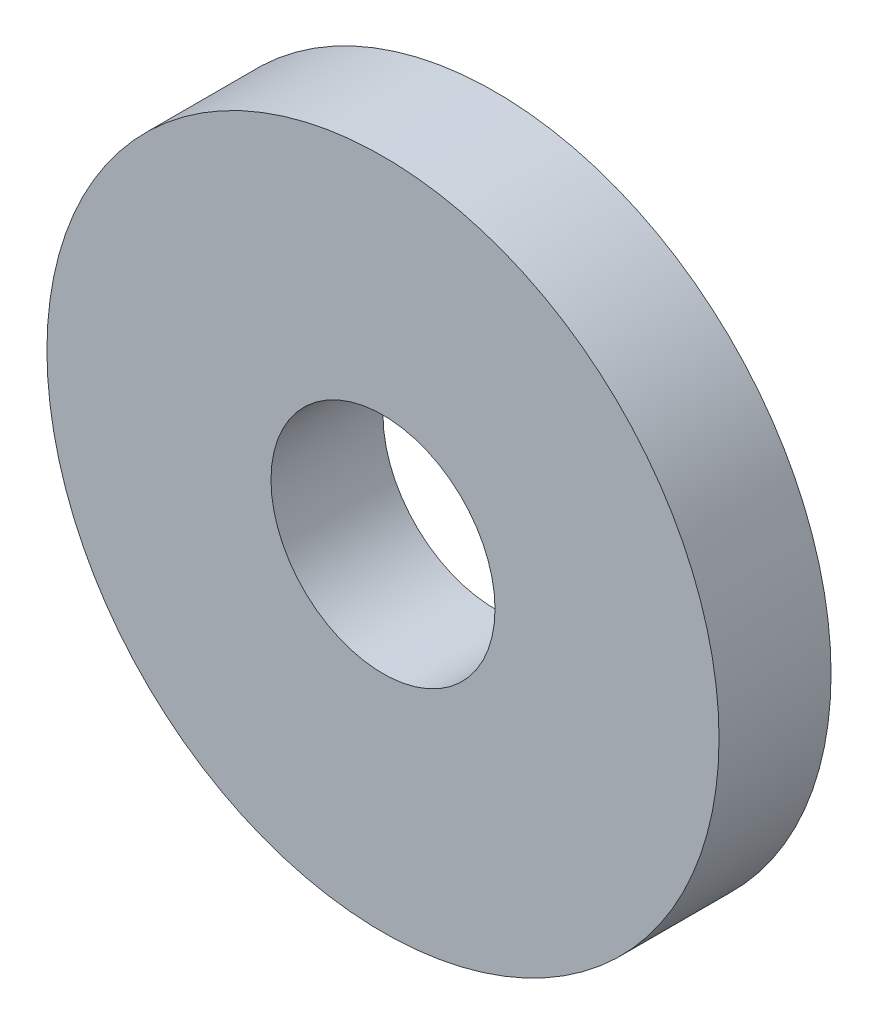
ISO-10303-21;
HEADER;
FILE_DESCRIPTION(('STEP AP214'),'2;1');
FILE_NAME('part.step','',(''),(''),'','','');
FILE_SCHEMA(('AUTOMOTIVE_DESIGN { 1 0 10303 214 1 1 1 1 }'));
ENDSEC;
DATA;
#1=APPLICATION_CONTEXT('core data for automotive mechanical design processes');
#2=APPLICATION_PROTOCOL_DEFINITION('international standard','automotive_design',2000,#1);
#3=PRODUCT_CONTEXT('',#1,'mechanical');
#4=PRODUCT('Part','Part','',(#3));
#5=PRODUCT_RELATED_PRODUCT_CATEGORY('part','',(#4));
#6=PRODUCT_DEFINITION_FORMATION('','',#4);
#7=PRODUCT_DEFINITION_CONTEXT('part definition',#1,'design');
#8=PRODUCT_DEFINITION('design','',#6,#7);
#9=PRODUCT_DEFINITION_SHAPE('','',#8);
#10=(LENGTH_UNIT() NAMED_UNIT(*) SI_UNIT(.MILLI.,.METRE.));
#11=(NAMED_UNIT(*) PLANE_ANGLE_UNIT() SI_UNIT($,.RADIAN.));
#12=(NAMED_UNIT(*) SI_UNIT($,.STERADIAN.) SOLID_ANGLE_UNIT());
#13=UNCERTAINTY_MEASURE_WITH_UNIT(LENGTH_MEASURE(1.E-05),#10,'distance_accuracy_value','');
#14=(GEOMETRIC_REPRESENTATION_CONTEXT(3) GLOBAL_UNCERTAINTY_ASSIGNED_CONTEXT((#13)) GLOBAL_UNIT_ASSIGNED_CONTEXT((#10,
#11,#12)) REPRESENTATION_CONTEXT('',''));
#15=CARTESIAN_POINT('',(0.,0.,0.));
#16=DIRECTION('',(0.,0.,1.));
#17=DIRECTION('',(1.,0.,0.));
#18=AXIS2_PLACEMENT_3D('',#15,#16,#17);
#19=CARTESIAN_POINT('',(0.,0.,10.));
#20=DIRECTION('',(0.,0.,-1.));
#21=DIRECTION('',(-1.,0.,0.));
#22=AXIS2_PLACEMENT_3D('',#19,#20,#21);
#23=CYLINDRICAL_SURFACE('',#22,30.);
#24=CARTESIAN_POINT('',(0.,0.,10.));
#25=DIRECTION('',(0.,0.,1.));
#26=DIRECTION('',(1.,0.,0.));
#27=AXIS2_PLACEMENT_3D('',#24,#25,#26);
#28=CIRCLE('',#27,30.);
#29=CARTESIAN_POINT('',(30.,0.,10.));
#30=VERTEX_POINT('',#29);
#31=EDGE_CURVE('E11',#30,#30,#28,.T.);
#32=ORIENTED_EDGE('',*,*,#31,.F.);
#33=EDGE_LOOP('',(#32));
#34=FACE_BOUND('',#33,.T.);
#35=CARTESIAN_POINT('',(0.,0.,0.));
#36=DIRECTION('',(0.,0.,1.));
#37=DIRECTION('',(1.,0.,0.));
#38=AXIS2_PLACEMENT_3D('',#35,#36,#37);
#39=CIRCLE('',#38,30.);
#40=CARTESIAN_POINT('',(30.,0.,0.));
#41=VERTEX_POINT('',#40);
#42=EDGE_CURVE('E46',#41,#41,#39,.T.);
#43=ORIENTED_EDGE('',*,*,#42,.T.);
#44=EDGE_LOOP('',(#43));
#45=FACE_BOUND('',#44,.T.);
#46=ADVANCED_FACE('F43',(#34,#45),#23,.T.);
#47=CARTESIAN_POINT('',(0.,0.,10.));
#48=DIRECTION('',(0.,0.,1.));
#49=DIRECTION('',(1.,0.,0.));
#50=AXIS2_PLACEMENT_3D('',#47,#48,#49);
#51=PLANE('',#50);
#52=CARTESIAN_POINT('',(0.,0.,10.));
#53=DIRECTION('',(0.,0.,-1.));
#54=DIRECTION('',(-1.,0.,0.));
#55=AXIS2_PLACEMENT_3D('',#52,#53,#54);
#56=CIRCLE('',#55,10.);
#57=CARTESIAN_POINT('',(-10.,0.,10.));
#58=VERTEX_POINT('',#57);
#59=EDGE_CURVE('E64',#58,#58,#56,.T.);
#60=ORIENTED_EDGE('',*,*,#59,.T.);
#61=EDGE_LOOP('',(#60));
#62=FACE_BOUND('',#61,.T.);
#63=ORIENTED_EDGE('',*,*,#31,.T.);
#64=EDGE_LOOP('',(#63));
#65=FACE_BOUND('',#64,.T.);
#66=ADVANCED_FACE('F73',(#62,#65),#51,.T.);
#67=CARTESIAN_POINT('',(0.,0.,0.));
#68=DIRECTION('',(0.,0.,1.));
#69=DIRECTION('',(1.,0.,0.));
#70=AXIS2_PLACEMENT_3D('',#67,#68,#69);
#71=PLANE('',#70);
#72=CARTESIAN_POINT('',(0.,0.,0.));
#73=DIRECTION('',(0.,0.,1.));
#74=DIRECTION('',(1.,0.,0.));
#75=AXIS2_PLACEMENT_3D('',#72,#73,#74);
#76=CIRCLE('',#75,20.);
#77=CARTESIAN_POINT('',(20.,0.,0.));
#78=VERTEX_POINT('',#77);
#79=EDGE_CURVE('E55',#78,#78,#76,.T.);
#80=ORIENTED_EDGE('',*,*,#79,.T.);
#81=EDGE_LOOP('',(#80));
#82=FACE_BOUND('',#81,.T.);
#83=ORIENTED_EDGE('',*,*,#42,.F.);
#84=EDGE_LOOP('',(#83));
#85=FACE_BOUND('',#84,.T.);
#86=ADVANCED_FACE('F85',(#82,#85),#71,.F.);
#87=CARTESIAN_POINT('',(0.,0.,7.));
#88=DIRECTION('',(0.,0.,1.));
#89=DIRECTION('',(1.,0.,0.));
#90=AXIS2_PLACEMENT_3D('',#87,#88,#89);
#91=PLANE('',#90);
#92=CARTESIAN_POINT('',(0.,0.,7.));
#93=DIRECTION('',(0.,0.,1.));
#94=DIRECTION('',(1.,0.,0.));
#95=AXIS2_PLACEMENT_3D('',#92,#93,#94);
#96=CIRCLE('',#95,20.);
#97=CARTESIAN_POINT('',(20.,0.,7.));
#98=VERTEX_POINT('',#97);
#99=EDGE_CURVE('E53',#98,#98,#96,.T.);
#100=ORIENTED_EDGE('',*,*,#99,.F.);
#101=EDGE_LOOP('',(#100));
#102=FACE_BOUND('',#101,.T.);
#103=CARTESIAN_POINT('',(0.,0.,7.));
#104=DIRECTION('',(0.,0.,1.));
#105=DIRECTION('',(1.,0.,0.));
#106=AXIS2_PLACEMENT_3D('',#103,#104,#105);
#107=CIRCLE('',#106,15.);
#108=CARTESIAN_POINT('',(15.,0.,7.));
#109=VERTEX_POINT('',#108);
#110=EDGE_CURVE('E58',#109,#109,#107,.T.);
#111=ORIENTED_EDGE('',*,*,#110,.T.);
#112=EDGE_LOOP('',(#111));
#113=FACE_BOUND('',#112,.T.);
#114=ADVANCED_FACE('F96',(#102,#113),#91,.F.);
#115=CARTESIAN_POINT('',(0.,0.,7.));
#116=DIRECTION('',(0.,0.,-1.));
#117=DIRECTION('',(-1.,0.,0.));
#118=AXIS2_PLACEMENT_3D('',#115,#116,#117);
#119=CYLINDRICAL_SURFACE('',#118,20.);
#120=ORIENTED_EDGE('',*,*,#99,.T.);
#121=EDGE_LOOP('',(#120));
#122=FACE_BOUND('',#121,.T.);
#123=ORIENTED_EDGE('',*,*,#79,.F.);
#124=EDGE_LOOP('',(#123));
#125=FACE_BOUND('',#124,.T.);
#126=ADVANCED_FACE('F89',(#122,#125),#119,.F.);
#127=CARTESIAN_POINT('',(0.,0.,7.));
#128=DIRECTION('',(0.,0.,-1.));
#129=DIRECTION('',(-1.,0.,0.));
#130=AXIS2_PLACEMENT_3D('',#127,#128,#129);
#131=CYLINDRICAL_SURFACE('',#130,15.);
#132=ORIENTED_EDGE('',*,*,#110,.F.);
#133=EDGE_LOOP('',(#132));
#134=FACE_BOUND('',#133,.T.);
#135=CARTESIAN_POINT('',(0.,0.,0.));
#136=DIRECTION('',(0.,0.,1.));
#137=DIRECTION('',(1.,0.,0.));
#138=AXIS2_PLACEMENT_3D('',#135,#136,#137);
#139=CIRCLE('',#138,15.);
#140=CARTESIAN_POINT('',(15.,0.,0.));
#141=VERTEX_POINT('',#140);
#142=EDGE_CURVE('E61',#141,#141,#139,.T.);
#143=ORIENTED_EDGE('',*,*,#142,.T.);
#144=EDGE_LOOP('',(#143));
#145=FACE_BOUND('',#144,.T.);
#146=ADVANCED_FACE('F84',(#134,#145),#131,.T.);
#147=CARTESIAN_POINT('',(0.,0.,0.));
#148=DIRECTION('',(0.,0.,-1.));
#149=DIRECTION('',(-1.,0.,0.));
#150=AXIS2_PLACEMENT_3D('',#147,#148,#149);
#151=CIRCLE('',#150,10.);
#152=CARTESIAN_POINT('',(-10.,0.,0.));
#153=VERTEX_POINT('',#152);
#154=EDGE_CURVE('E67',#153,#153,#151,.T.);
#155=ORIENTED_EDGE('',*,*,#154,.F.);
#156=EDGE_LOOP('',(#155));
#157=FACE_BOUND('',#156,.T.);
#158=ORIENTED_EDGE('',*,*,#142,.F.);
#159=EDGE_LOOP('',(#158));
#160=FACE_BOUND('',#159,.T.);
#161=ADVANCED_FACE('F78',(#157,#160),#71,.F.);
#162=CARTESIAN_POINT('',(0.,0.,10.));
#163=DIRECTION('',(0.,0.,-1.));
#164=DIRECTION('',(-1.,0.,0.));
#165=AXIS2_PLACEMENT_3D('',#162,#163,#164);
#166=CYLINDRICAL_SURFACE('',#165,10.);
#167=ORIENTED_EDGE('',*,*,#59,.F.);
#168=EDGE_LOOP('',(#167));
#169=FACE_BOUND('',#168,.T.);
#170=ORIENTED_EDGE('',*,*,#154,.T.);
#171=EDGE_LOOP('',(#170));
#172=FACE_BOUND('',#171,.T.);
#173=ADVANCED_FACE('F75',(#169,#172),#166,.F.);
#174=CLOSED_SHELL('',(#46,#66,#86,#114,#126,#146,#161,#173));
#175=MANIFOLD_SOLID_BREP('B2',#174);
#176=ADVANCED_BREP_SHAPE_REPRESENTATION('',(#18,#175),#14);
#177=SHAPE_DEFINITION_REPRESENTATION(#9,#176);
ENDSEC;
END-ISO-10303-21;
